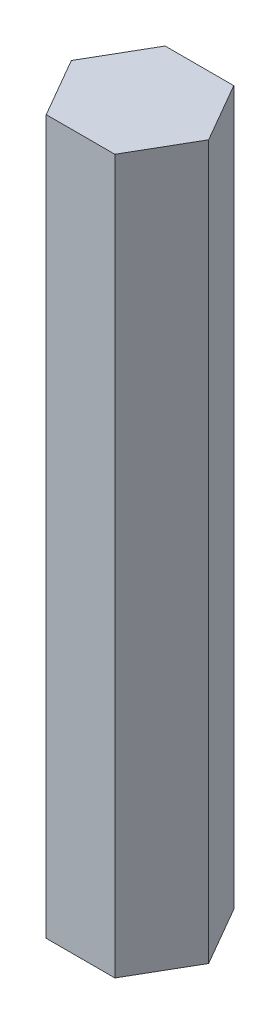
ISO-10303-21;
HEADER;
FILE_DESCRIPTION(('STEP AP214'),'2;1');
FILE_NAME('part.step','',(''),(''),'','','');
FILE_SCHEMA(('AUTOMOTIVE_DESIGN { 1 0 10303 214 1 1 1 1 }'));
ENDSEC;
DATA;
#1=APPLICATION_CONTEXT('core data for automotive mechanical design processes');
#2=APPLICATION_PROTOCOL_DEFINITION('international standard','automotive_design',2000,#1);
#3=PRODUCT_CONTEXT('',#1,'mechanical');
#4=PRODUCT('Part','Part','',(#3));
#5=PRODUCT_RELATED_PRODUCT_CATEGORY('part','',(#4));
#6=PRODUCT_DEFINITION_FORMATION('','',#4);
#7=PRODUCT_DEFINITION_CONTEXT('part definition',#1,'design');
#8=PRODUCT_DEFINITION('design','',#6,#7);
#9=PRODUCT_DEFINITION_SHAPE('','',#8);
#10=(LENGTH_UNIT() NAMED_UNIT(*) SI_UNIT(.MILLI.,.METRE.));
#11=(NAMED_UNIT(*) PLANE_ANGLE_UNIT() SI_UNIT($,.RADIAN.));
#12=(NAMED_UNIT(*) SI_UNIT($,.STERADIAN.) SOLID_ANGLE_UNIT());
#13=UNCERTAINTY_MEASURE_WITH_UNIT(LENGTH_MEASURE(1.E-05),#10,'distance_accuracy_value','');
#14=(GEOMETRIC_REPRESENTATION_CONTEXT(3) GLOBAL_UNCERTAINTY_ASSIGNED_CONTEXT((#13)) GLOBAL_UNIT_ASSIGNED_CONTEXT((#10,
#11,#12)) REPRESENTATION_CONTEXT('',''));
#15=CARTESIAN_POINT('',(0.,0.,0.));
#16=DIRECTION('',(0.,0.,1.));
#17=DIRECTION('',(1.,0.,0.));
#18=AXIS2_PLACEMENT_3D('',#15,#16,#17);
#19=CARTESIAN_POINT('',(3.6661742093542,76.2,6.34999999999996));
#20=DIRECTION('',(-0.866025403784442,0.,-0.499999999999995));
#21=DIRECTION('',(-0.499999999999995,0.,0.866025403784442));
#22=AXIS2_PLACEMENT_3D('',#19,#20,#21);
#23=PLANE('',#22);
#24=DIRECTION('',(0.499999999999995,0.,-0.866025403784442));
#25=VECTOR('',#24,1.);
#26=CARTESIAN_POINT('',(3.6661742093542,0.,6.34999999999996));
#27=LINE('',#26,#25);
#28=CARTESIAN_POINT('',(3.6661742093542,0.,6.34999999999996));
#29=VERTEX_POINT('',#28);
#30=CARTESIAN_POINT('',(7.33234841870825,0.,0.));
#31=VERTEX_POINT('',#30);
#32=EDGE_CURVE('E118',#29,#31,#27,.T.);
#33=ORIENTED_EDGE('',*,*,#32,.T.);
#34=DIRECTION('',(0.,-1.,0.));
#35=VECTOR('',#34,1.);
#36=CARTESIAN_POINT('',(7.33234841870825,76.2,0.));
#37=LINE('',#36,#35);
#38=CARTESIAN_POINT('',(7.33234841870825,76.2,0.));
#39=VERTEX_POINT('',#38);
#40=EDGE_CURVE('E11',#39,#31,#37,.T.);
#41=ORIENTED_EDGE('',*,*,#40,.F.);
#42=DIRECTION('',(0.499999999999995,0.,-0.866025403784442));
#43=VECTOR('',#42,1.);
#44=CARTESIAN_POINT('',(3.6661742093542,76.2,6.34999999999996));
#45=LINE('',#44,#43);
#46=CARTESIAN_POINT('',(3.6661742093542,76.2,6.34999999999996));
#47=VERTEX_POINT('',#46);
#48=EDGE_CURVE('E128',#47,#39,#45,.T.);
#49=ORIENTED_EDGE('',*,*,#48,.F.);
#50=DIRECTION('',(0.,-1.,0.));
#51=VECTOR('',#50,1.);
#52=CARTESIAN_POINT('',(3.6661742093542,76.2,6.34999999999996));
#53=LINE('',#52,#51);
#54=EDGE_CURVE('E114',#47,#29,#53,.T.);
#55=ORIENTED_EDGE('',*,*,#54,.T.);
#56=EDGE_LOOP('',(#33,#41,#49,#55));
#57=FACE_BOUND('',#56,.T.);
#58=ADVANCED_FACE('F34',(#57),#23,.F.);
#59=CARTESIAN_POINT('',(7.33234841870825,76.2,0.));
#60=DIRECTION('',(-0.866025403784438,0.,0.500000000000001));
#61=DIRECTION('',(0.500000000000001,0.,0.866025403784438));
#62=AXIS2_PLACEMENT_3D('',#59,#60,#61);
#63=PLANE('',#62);
#64=DIRECTION('',(-0.500000000000001,0.,-0.866025403784438));
#65=VECTOR('',#64,1.);
#66=CARTESIAN_POINT('',(7.33234841870825,0.,0.));
#67=LINE('',#66,#65);
#68=CARTESIAN_POINT('',(3.66617420935411,0.,-6.35000000000001));
#69=VERTEX_POINT('',#68);
#70=EDGE_CURVE('E121',#31,#69,#67,.T.);
#71=ORIENTED_EDGE('',*,*,#70,.T.);
#72=DIRECTION('',(0.,-1.,0.));
#73=VECTOR('',#72,1.);
#74=CARTESIAN_POINT('',(3.66617420935411,76.2,-6.35000000000001));
#75=LINE('',#74,#73);
#76=CARTESIAN_POINT('',(3.66617420935411,76.2,-6.35000000000001));
#77=VERTEX_POINT('',#76);
#78=EDGE_CURVE('E42',#77,#69,#75,.T.);
#79=ORIENTED_EDGE('',*,*,#78,.F.);
#80=DIRECTION('',(-0.500000000000001,0.,-0.866025403784438));
#81=VECTOR('',#80,1.);
#82=CARTESIAN_POINT('',(7.33234841870825,76.2,0.));
#83=LINE('',#82,#81);
#84=EDGE_CURVE('E87',#39,#77,#83,.T.);
#85=ORIENTED_EDGE('',*,*,#84,.F.);
#86=ORIENTED_EDGE('',*,*,#40,.T.);
#87=EDGE_LOOP('',(#71,#79,#85,#86));
#88=FACE_BOUND('',#87,.T.);
#89=ADVANCED_FACE('F152',(#88),#63,.F.);
#90=CARTESIAN_POINT('',(3.66617420935411,76.2,-6.35000000000001));
#91=DIRECTION('',(0.,0.,1.));
#92=DIRECTION('',(1.,0.,0.));
#93=AXIS2_PLACEMENT_3D('',#90,#91,#92);
#94=PLANE('',#93);
#95=DIRECTION('',(-1.,0.,0.));
#96=VECTOR('',#95,1.);
#97=CARTESIAN_POINT('',(3.66617420935411,0.,-6.35000000000001));
#98=LINE('',#97,#96);
#99=CARTESIAN_POINT('',(-3.66617420935416,0.,-6.34999999999999));
#100=VERTEX_POINT('',#99);
#101=EDGE_CURVE('E123',#69,#100,#98,.T.);
#102=ORIENTED_EDGE('',*,*,#101,.T.);
#103=DIRECTION('',(0.,-1.,0.));
#104=VECTOR('',#103,1.);
#105=CARTESIAN_POINT('',(-3.66617420935416,76.2,-6.34999999999999));
#106=LINE('',#105,#104);
#107=CARTESIAN_POINT('',(-3.66617420935416,76.2,-6.34999999999999));
#108=VERTEX_POINT('',#107);
#109=EDGE_CURVE('E109',#108,#100,#106,.T.);
#110=ORIENTED_EDGE('',*,*,#109,.F.);
#111=DIRECTION('',(-1.,0.,0.));
#112=VECTOR('',#111,1.);
#113=CARTESIAN_POINT('',(3.66617420935411,76.2,-6.35000000000001));
#114=LINE('',#113,#112);
#115=EDGE_CURVE('E100',#77,#108,#114,.T.);
#116=ORIENTED_EDGE('',*,*,#115,.F.);
#117=ORIENTED_EDGE('',*,*,#78,.T.);
#118=EDGE_LOOP('',(#102,#110,#116,#117));
#119=FACE_BOUND('',#118,.T.);
#120=ADVANCED_FACE('F134',(#119),#94,.F.);
#121=CARTESIAN_POINT('',(-3.66617420935416,76.2,-6.34999999999999));
#122=DIRECTION('',(0.866025403784442,0.,0.499999999999995));
#123=DIRECTION('',(0.499999999999995,0.,-0.866025403784442));
#124=AXIS2_PLACEMENT_3D('',#121,#122,#123);
#125=PLANE('',#124);
#126=DIRECTION('',(-0.499999999999995,0.,0.866025403784441));
#127=VECTOR('',#126,1.);
#128=CARTESIAN_POINT('',(-3.66617420935416,0.,-6.34999999999999));
#129=LINE('',#128,#127);
#130=CARTESIAN_POINT('',(-7.33234841870825,0.,0.));
#131=VERTEX_POINT('',#130);
#132=EDGE_CURVE('E108',#100,#131,#129,.T.);
#133=ORIENTED_EDGE('',*,*,#132,.T.);
#134=DIRECTION('',(0.,-1.,0.));
#135=VECTOR('',#134,1.);
#136=CARTESIAN_POINT('',(-7.33234841870825,76.2,0.));
#137=LINE('',#136,#135);
#138=CARTESIAN_POINT('',(-7.33234841870825,76.2,0.));
#139=VERTEX_POINT('',#138);
#140=EDGE_CURVE('E105',#139,#131,#137,.T.);
#141=ORIENTED_EDGE('',*,*,#140,.F.);
#142=DIRECTION('',(-0.499999999999995,0.,0.866025403784441));
#143=VECTOR('',#142,1.);
#144=CARTESIAN_POINT('',(-3.66617420935416,76.2,-6.34999999999999));
#145=LINE('',#144,#143);
#146=EDGE_CURVE('E94',#108,#139,#145,.T.);
#147=ORIENTED_EDGE('',*,*,#146,.F.);
#148=ORIENTED_EDGE('',*,*,#109,.T.);
#149=EDGE_LOOP('',(#133,#141,#147,#148));
#150=FACE_BOUND('',#149,.T.);
#151=ADVANCED_FACE('F106',(#150),#125,.F.);
#152=CARTESIAN_POINT('',(-7.33234841870825,76.2,0.));
#153=DIRECTION('',(0.866025403784435,0.,-0.500000000000007));
#154=DIRECTION('',(-0.500000000000007,0.,-0.866025403784434));
#155=AXIS2_PLACEMENT_3D('',#152,#153,#154);
#156=PLANE('',#155);
#157=DIRECTION('',(0.500000000000007,0.,0.866025403784434));
#158=VECTOR('',#157,1.);
#159=CARTESIAN_POINT('',(-7.33234841870825,0.,0.));
#160=LINE('',#159,#158);
#161=CARTESIAN_POINT('',(-3.66617420935407,0.,6.35000000000004));
#162=VERTEX_POINT('',#161);
#163=EDGE_CURVE('E73',#131,#162,#160,.T.);
#164=ORIENTED_EDGE('',*,*,#163,.T.);
#165=DIRECTION('',(0.,-1.,0.));
#166=VECTOR('',#165,1.);
#167=CARTESIAN_POINT('',(-3.66617420935407,76.2,6.35000000000004));
#168=LINE('',#167,#166);
#169=CARTESIAN_POINT('',(-3.66617420935407,76.2,6.35000000000004));
#170=VERTEX_POINT('',#169);
#171=EDGE_CURVE('E110',#170,#162,#168,.T.);
#172=ORIENTED_EDGE('',*,*,#171,.F.);
#173=DIRECTION('',(0.500000000000007,0.,0.866025403784434));
#174=VECTOR('',#173,1.);
#175=CARTESIAN_POINT('',(-7.33234841870825,76.2,0.));
#176=LINE('',#175,#174);
#177=EDGE_CURVE('E98',#139,#170,#176,.T.);
#178=ORIENTED_EDGE('',*,*,#177,.F.);
#179=ORIENTED_EDGE('',*,*,#140,.T.);
#180=EDGE_LOOP('',(#164,#172,#178,#179));
#181=FACE_BOUND('',#180,.T.);
#182=ADVANCED_FACE('F112',(#181),#156,.F.);
#183=CARTESIAN_POINT('',(-3.66617420935407,76.2,6.35000000000004));
#184=DIRECTION('',(0.,0.,-1.));
#185=DIRECTION('',(-1.,0.,0.));
#186=AXIS2_PLACEMENT_3D('',#183,#184,#185);
#187=PLANE('',#186);
#188=DIRECTION('',(1.,0.,0.));
#189=VECTOR('',#188,1.);
#190=CARTESIAN_POINT('',(-3.66617420935407,0.,6.35000000000004));
#191=LINE('',#190,#189);
#192=EDGE_CURVE('E79',#162,#29,#191,.T.);
#193=ORIENTED_EDGE('',*,*,#192,.T.);
#194=ORIENTED_EDGE('',*,*,#54,.F.);
#195=DIRECTION('',(1.,0.,0.));
#196=VECTOR('',#195,1.);
#197=CARTESIAN_POINT('',(-3.66617420935407,76.2,6.35000000000004));
#198=LINE('',#197,#196);
#199=EDGE_CURVE('E50',#170,#47,#198,.T.);
#200=ORIENTED_EDGE('',*,*,#199,.F.);
#201=ORIENTED_EDGE('',*,*,#171,.T.);
#202=EDGE_LOOP('',(#193,#194,#200,#201));
#203=FACE_BOUND('',#202,.T.);
#204=ADVANCED_FACE('F141',(#203),#187,.F.);
#205=CARTESIAN_POINT('',(0.,76.2,0.));
#206=DIRECTION('',(0.,1.,0.));
#207=DIRECTION('',(0.,0.,1.));
#208=AXIS2_PLACEMENT_3D('',#205,#206,#207);
#209=PLANE('',#208);
#210=ORIENTED_EDGE('',*,*,#48,.T.);
#211=ORIENTED_EDGE('',*,*,#84,.T.);
#212=ORIENTED_EDGE('',*,*,#115,.T.);
#213=ORIENTED_EDGE('',*,*,#146,.T.);
#214=ORIENTED_EDGE('',*,*,#177,.T.);
#215=ORIENTED_EDGE('',*,*,#199,.T.);
#216=EDGE_LOOP('',(#210,#211,#212,#213,#214,#215));
#217=FACE_BOUND('',#216,.T.);
#218=ADVANCED_FACE('F96',(#217),#209,.T.);
#219=CARTESIAN_POINT('',(0.,0.,0.));
#220=DIRECTION('',(0.,1.,0.));
#221=DIRECTION('',(0.,0.,1.));
#222=AXIS2_PLACEMENT_3D('',#219,#220,#221);
#223=PLANE('',#222);
#224=ORIENTED_EDGE('',*,*,#32,.F.);
#225=ORIENTED_EDGE('',*,*,#192,.F.);
#226=ORIENTED_EDGE('',*,*,#163,.F.);
#227=ORIENTED_EDGE('',*,*,#132,.F.);
#228=ORIENTED_EDGE('',*,*,#101,.F.);
#229=ORIENTED_EDGE('',*,*,#70,.F.);
#230=EDGE_LOOP('',(#224,#225,#226,#227,#228,#229));
#231=FACE_BOUND('',#230,.T.);
#232=ADVANCED_FACE('F137',(#231),#223,.F.);
#233=CLOSED_SHELL('',(#58,#89,#120,#151,#182,#204,#218,#232));
#234=MANIFOLD_SOLID_BREP('B2',#233);
#235=ADVANCED_BREP_SHAPE_REPRESENTATION('',(#18,#234),#14);
#236=SHAPE_DEFINITION_REPRESENTATION(#9,#235);
ENDSEC;
END-ISO-10303-21;
